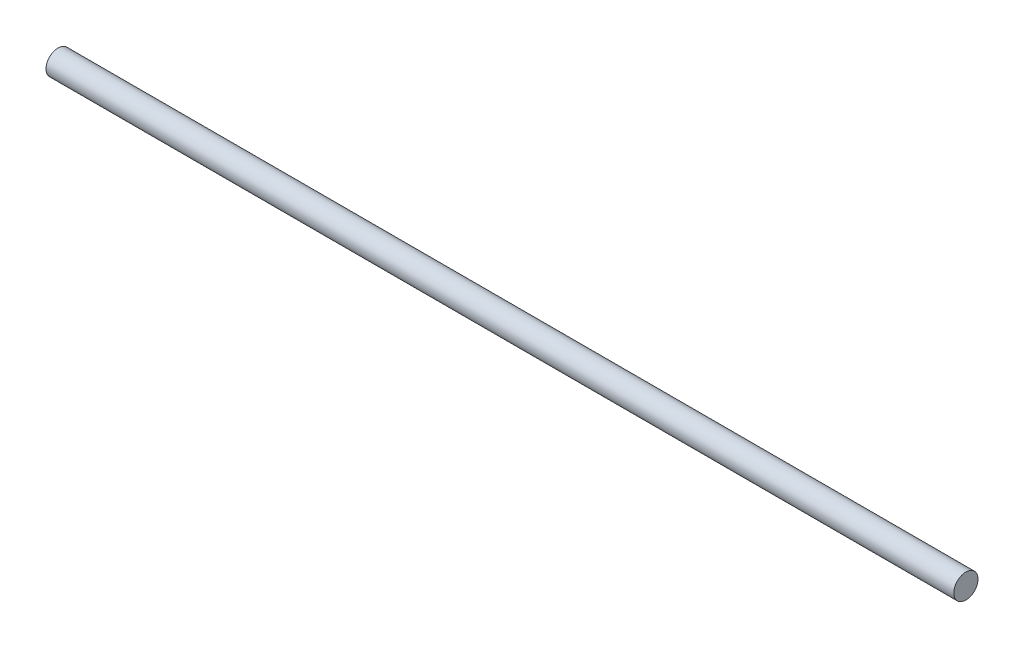
ISO-10303-21;
HEADER;
FILE_DESCRIPTION(('STEP AP214'),'2;1');
FILE_NAME('part.step','',(''),(''),'','','');
FILE_SCHEMA(('AUTOMOTIVE_DESIGN { 1 0 10303 214 1 1 1 1 }'));
ENDSEC;
DATA;
#1=APPLICATION_CONTEXT('core data for automotive mechanical design processes');
#2=APPLICATION_PROTOCOL_DEFINITION('international standard','automotive_design',2000,#1);
#3=PRODUCT_CONTEXT('',#1,'mechanical');
#4=PRODUCT('Part','Part','',(#3));
#5=PRODUCT_RELATED_PRODUCT_CATEGORY('part','',(#4));
#6=PRODUCT_DEFINITION_FORMATION('','',#4);
#7=PRODUCT_DEFINITION_CONTEXT('part definition',#1,'design');
#8=PRODUCT_DEFINITION('design','',#6,#7);
#9=PRODUCT_DEFINITION_SHAPE('','',#8);
#10=(LENGTH_UNIT() NAMED_UNIT(*) SI_UNIT(.MILLI.,.METRE.));
#11=(NAMED_UNIT(*) PLANE_ANGLE_UNIT() SI_UNIT($,.RADIAN.));
#12=(NAMED_UNIT(*) SI_UNIT($,.STERADIAN.) SOLID_ANGLE_UNIT());
#13=UNCERTAINTY_MEASURE_WITH_UNIT(LENGTH_MEASURE(1.E-05),#10,'distance_accuracy_value','');
#14=(GEOMETRIC_REPRESENTATION_CONTEXT(3) GLOBAL_UNCERTAINTY_ASSIGNED_CONTEXT((#13)) GLOBAL_UNIT_ASSIGNED_CONTEXT((#10,
#11,#12)) REPRESENTATION_CONTEXT('',''));
#15=CARTESIAN_POINT('',(0.,0.,0.));
#16=DIRECTION('',(0.,0.,1.));
#17=DIRECTION('',(1.,0.,0.));
#18=AXIS2_PLACEMENT_3D('',#15,#16,#17);
#19=CARTESIAN_POINT('',(474.8,0.,0.));
#20=DIRECTION('',(-1.,0.,0.));
#21=DIRECTION('',(0.,0.,1.));
#22=AXIS2_PLACEMENT_3D('',#19,#20,#21);
#23=CYLINDRICAL_SURFACE('',#22,6.35);
#24=CARTESIAN_POINT('',(474.8,0.,0.));
#25=DIRECTION('',(1.,0.,0.));
#26=DIRECTION('',(0.,0.,-1.));
#27=AXIS2_PLACEMENT_3D('',#24,#25,#26);
#28=CIRCLE('',#27,6.35);
#29=CARTESIAN_POINT('',(474.8,0.,6.35));
#30=VERTEX_POINT('',#29);
#31=EDGE_CURVE('E10',#30,#30,#28,.T.);
#32=CARTESIAN_POINT('',(0.,0.,0.));
#33=DIRECTION('',(1.,0.,0.));
#34=DIRECTION('',(0.,0.,-1.));
#35=AXIS2_PLACEMENT_3D('',#32,#33,#34);
#36=CIRCLE('',#35,6.35);
#37=CARTESIAN_POINT('',(0.,0.,6.35));
#38=VERTEX_POINT('',#37);
#39=EDGE_CURVE('E34',#38,#38,#36,.T.);
#40=CARTESIAN_POINT('',(474.8,0.,6.35));
#41=CARTESIAN_POINT('',(469.854166666667,0.,6.35));
#42=CARTESIAN_POINT('',(464.908333333333,0.,6.35));
#43=CARTESIAN_POINT('',(455.016666666667,0.,6.35));
#44=CARTESIAN_POINT('',(450.070833333333,0.,6.35));
#45=CARTESIAN_POINT('',(440.179166666667,0.,6.35));
#46=CARTESIAN_POINT('',(435.233333333333,0.,6.35));
#47=CARTESIAN_POINT('',(425.341666666667,0.,6.35));
#48=CARTESIAN_POINT('',(420.395833333333,0.,6.35));
#49=CARTESIAN_POINT('',(410.504166666667,0.,6.35));
#50=CARTESIAN_POINT('',(405.558333333333,0.,6.35));
#51=CARTESIAN_POINT('',(395.666666666667,0.,6.35));
#52=CARTESIAN_POINT('',(390.720833333333,0.,6.35));
#53=CARTESIAN_POINT('',(380.829166666667,0.,6.35));
#54=CARTESIAN_POINT('',(375.883333333333,0.,6.35));
#55=CARTESIAN_POINT('',(365.991666666667,0.,6.35));
#56=CARTESIAN_POINT('',(361.045833333333,0.,6.35));
#57=CARTESIAN_POINT('',(351.154166666667,0.,6.35));
#58=CARTESIAN_POINT('',(346.208333333333,0.,6.35));
#59=CARTESIAN_POINT('',(336.316666666667,0.,6.35));
#60=CARTESIAN_POINT('',(331.370833333333,0.,6.35));
#61=CARTESIAN_POINT('',(321.479166666667,0.,6.35));
#62=CARTESIAN_POINT('',(316.533333333333,0.,6.35));
#63=CARTESIAN_POINT('',(306.641666666667,0.,6.35));
#64=CARTESIAN_POINT('',(301.695833333333,0.,6.35));
#65=CARTESIAN_POINT('',(291.804166666667,0.,6.35));
#66=CARTESIAN_POINT('',(286.858333333333,0.,6.35));
#67=CARTESIAN_POINT('',(276.966666666667,0.,6.35));
#68=CARTESIAN_POINT('',(272.020833333333,0.,6.35));
#69=CARTESIAN_POINT('',(262.129166666667,0.,6.35));
#70=CARTESIAN_POINT('',(257.183333333333,0.,6.35));
#71=CARTESIAN_POINT('',(247.291666666667,0.,6.35));
#72=CARTESIAN_POINT('',(242.345833333333,0.,6.35));
#73=CARTESIAN_POINT('',(232.454166666667,0.,6.35));
#74=CARTESIAN_POINT('',(227.508333333333,0.,6.35));
#75=CARTESIAN_POINT('',(217.616666666667,0.,6.35));
#76=CARTESIAN_POINT('',(212.670833333333,0.,6.35));
#77=CARTESIAN_POINT('',(202.779166666667,0.,6.35));
#78=CARTESIAN_POINT('',(197.833333333333,0.,6.35));
#79=CARTESIAN_POINT('',(187.941666666667,0.,6.35));
#80=CARTESIAN_POINT('',(182.995833333333,0.,6.35));
#81=CARTESIAN_POINT('',(173.104166666667,0.,6.35));
#82=CARTESIAN_POINT('',(168.158333333333,0.,6.35));
#83=CARTESIAN_POINT('',(158.266666666667,0.,6.35));
#84=CARTESIAN_POINT('',(153.320833333333,0.,6.35));
#85=CARTESIAN_POINT('',(143.429166666667,0.,6.35));
#86=CARTESIAN_POINT('',(138.483333333333,0.,6.35));
#87=CARTESIAN_POINT('',(128.591666666667,0.,6.35));
#88=CARTESIAN_POINT('',(123.645833333333,0.,6.35));
#89=CARTESIAN_POINT('',(113.754166666667,0.,6.35));
#90=CARTESIAN_POINT('',(108.808333333333,0.,6.35));
#91=CARTESIAN_POINT('',(98.9166666666666,0.,6.35));
#92=CARTESIAN_POINT('',(93.9708333333333,0.,6.35));
#93=CARTESIAN_POINT('',(84.0791666666666,0.,6.35));
#94=CARTESIAN_POINT('',(79.1333333333333,0.,6.35));
#95=CARTESIAN_POINT('',(69.2416666666666,0.,6.35));
#96=CARTESIAN_POINT('',(64.2958333333333,0.,6.35));
#97=CARTESIAN_POINT('',(54.4041666666666,0.,6.35));
#98=CARTESIAN_POINT('',(49.4583333333333,0.,6.35));
#99=CARTESIAN_POINT('',(39.5666666666666,0.,6.35));
#100=CARTESIAN_POINT('',(34.6208333333333,0.,6.35));
#101=CARTESIAN_POINT('',(24.7291666666666,0.,6.35));
#102=CARTESIAN_POINT('',(19.7833333333333,0.,6.35));
#103=CARTESIAN_POINT('',(9.89166666666662,0.,6.35));
#104=CARTESIAN_POINT('',(4.94583333333328,0.,6.35));
#105=CARTESIAN_POINT('',(0.,0.,6.35));
#106=B_SPLINE_CURVE_WITH_KNOTS('',3,(#40,#41,#42,#43,#44,#45,#46,#47,#48,#49,#50,#51,#52,#53,
#54,#55,#56,#57,#58,#59,#60,#61,#62,#63,#64,#65,#66,#67,#68,#69,#70,#71,#72,#73,#74,#75,#76,#77,
#78,#79,#80,#81,#82,#83,#84,#85,#86,#87,#88,#89,#90,#91,#92,#93,#94,#95,#96,#97,#98,#99,#100,
#101,#102,#103,#104,#105),.UNSPECIFIED.,.F.,.F.,(4,2,2,2,2,2,2,2,2,2,2,2,2,2,2,2,2,2,2,2,2,2,2,
2,2,2,2,2,2,2,2,2,4),(0.,14.8375,29.675,44.5125,59.35,74.1875,89.025,103.8625,118.7,133.5375,
148.375,163.2125,178.05,192.8875,207.725,222.5625,237.4,252.2375,267.075,281.9125,296.75,
311.5875,326.425,341.2625,356.1,370.9375,385.775,400.6125,415.45,430.2875,445.125,459.9625,
474.8),.UNSPECIFIED.);
#107=EDGE_CURVE('BSEAM31',#30,#38,#106,.T.);
#108=ORIENTED_EDGE('',*,*,#31,.F.);
#109=ORIENTED_EDGE('',*,*,#39,.T.);
#110=ORIENTED_EDGE('',*,*,#107,.T.);
#111=ORIENTED_EDGE('',*,*,#107,.F.);
#112=EDGE_LOOP('',(#108,#110,#109,#111));
#113=FACE_BOUND('',#112,.T.);
#114=ADVANCED_FACE('F31',(#113),#23,.T.);
#115=CARTESIAN_POINT('',(474.8,0.,0.));
#116=DIRECTION('',(1.,0.,0.));
#117=DIRECTION('',(0.,0.,-1.));
#118=AXIS2_PLACEMENT_3D('',#115,#116,#117);
#119=PLANE('',#118);
#120=ORIENTED_EDGE('',*,*,#31,.T.);
#121=EDGE_LOOP('',(#120));
#122=FACE_BOUND('',#121,.T.);
#123=ADVANCED_FACE('F46',(#122),#119,.T.);
#124=CARTESIAN_POINT('',(0.,0.,0.));
#125=DIRECTION('',(1.,0.,0.));
#126=DIRECTION('',(0.,0.,-1.));
#127=AXIS2_PLACEMENT_3D('',#124,#125,#126);
#128=PLANE('',#127);
#129=ORIENTED_EDGE('',*,*,#39,.F.);
#130=EDGE_LOOP('',(#129));
#131=FACE_BOUND('',#130,.T.);
#132=ADVANCED_FACE('F44',(#131),#128,.F.);
#133=CLOSED_SHELL('',(#114,#123,#132));
#134=MANIFOLD_SOLID_BREP('B2',#133);
#135=ADVANCED_BREP_SHAPE_REPRESENTATION('',(#18,#134),#14);
#136=SHAPE_DEFINITION_REPRESENTATION(#9,#135);
ENDSEC;
END-ISO-10303-21;
